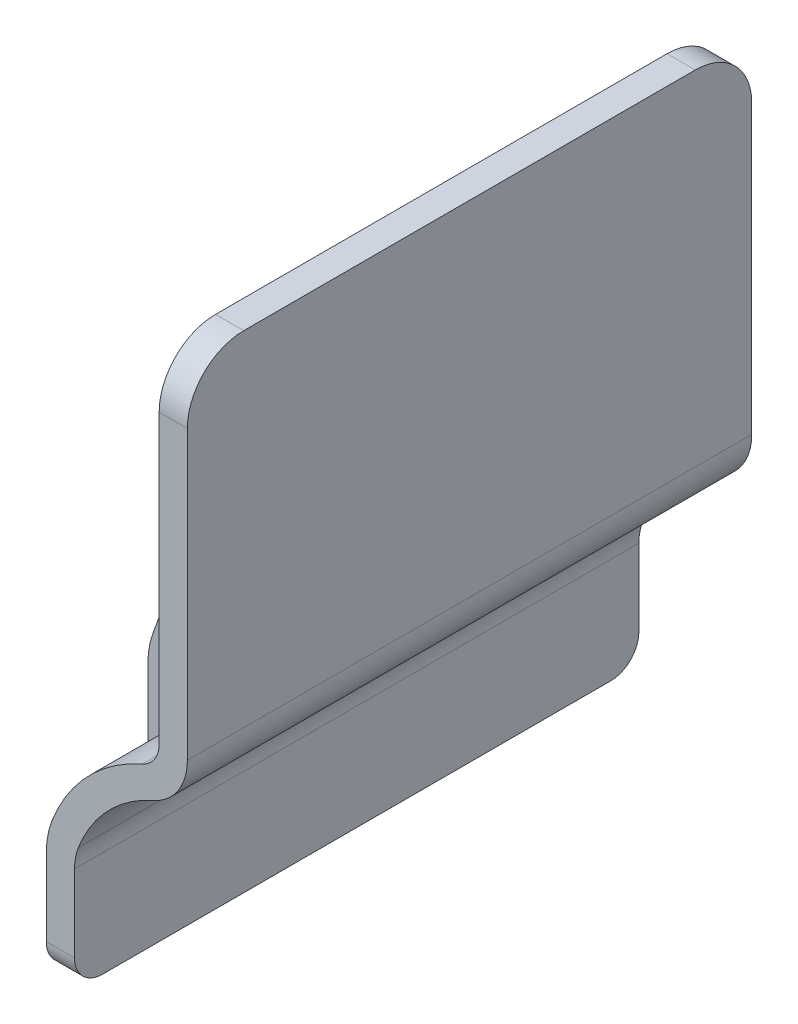
ISO-10303-21;
HEADER;
FILE_DESCRIPTION(('STEP AP214'),'2;1');
FILE_NAME('part.step','',(''),(''),'','','');
FILE_SCHEMA(('AUTOMOTIVE_DESIGN { 1 0 10303 214 1 1 1 1 }'));
ENDSEC;
DATA;
#1=APPLICATION_CONTEXT('core data for automotive mechanical design processes');
#2=APPLICATION_PROTOCOL_DEFINITION('international standard','automotive_design',2000,#1);
#3=PRODUCT_CONTEXT('',#1,'mechanical');
#4=PRODUCT('Part','Part','',(#3));
#5=PRODUCT_RELATED_PRODUCT_CATEGORY('part','',(#4));
#6=PRODUCT_DEFINITION_FORMATION('','',#4);
#7=PRODUCT_DEFINITION_CONTEXT('part definition',#1,'design');
#8=PRODUCT_DEFINITION('design','',#6,#7);
#9=PRODUCT_DEFINITION_SHAPE('','',#8);
#10=(LENGTH_UNIT() NAMED_UNIT(*) SI_UNIT(.MILLI.,.METRE.));
#11=(NAMED_UNIT(*) PLANE_ANGLE_UNIT() SI_UNIT($,.RADIAN.));
#12=(NAMED_UNIT(*) SI_UNIT($,.STERADIAN.) SOLID_ANGLE_UNIT());
#13=UNCERTAINTY_MEASURE_WITH_UNIT(LENGTH_MEASURE(1.E-05),#10,'distance_accuracy_value','');
#14=(GEOMETRIC_REPRESENTATION_CONTEXT(3) GLOBAL_UNCERTAINTY_ASSIGNED_CONTEXT((#13)) GLOBAL_UNIT_ASSIGNED_CONTEXT((#10,
#11,#12)) REPRESENTATION_CONTEXT('',''));
#15=CARTESIAN_POINT('',(0.,0.,0.));
#16=DIRECTION('',(0.,0.,1.));
#17=DIRECTION('',(1.,0.,0.));
#18=AXIS2_PLACEMENT_3D('',#15,#16,#17);
#19=CARTESIAN_POINT('',(6.,192.32802986469,-33.0000000000047));
#20=DIRECTION('',(0.,0.,-1.));
#21=DIRECTION('',(-1.,0.,0.));
#22=AXIS2_PLACEMENT_3D('',#19,#20,#21);
#23=CYLINDRICAL_SURFACE('',#22,5.);
#24=CARTESIAN_POINT('',(6.,192.32802986469,-111.000000000005));
#25=DIRECTION('',(0.,0.,-1.));
#26=DIRECTION('',(-1.,0.,0.));
#27=AXIS2_PLACEMENT_3D('',#24,#25,#26);
#28=CIRCLE('',#27,5.00000000000001);
#29=CARTESIAN_POINT('',(11.,192.32802986469,-111.000000000005));
#30=VERTEX_POINT('',#29);
#31=CARTESIAN_POINT('',(8.,187.745454169734,-111.000000000005));
#32=VERTEX_POINT('',#31);
#33=EDGE_CURVE('E286',#30,#32,#28,.T.);
#34=ORIENTED_EDGE('',*,*,#33,.T.);
#35=DIRECTION('',(0.,0.,-1.));
#36=VECTOR('',#35,1.);
#37=CARTESIAN_POINT('',(7.99999999999999,187.745454169734,-33.0000000000047));
#38=LINE('',#37,#36);
#39=CARTESIAN_POINT('',(8.,187.745454169734,-55.0000000000047));
#40=VERTEX_POINT('',#39);
#41=EDGE_CURVE('E420',#40,#32,#38,.T.);
#42=ORIENTED_EDGE('',*,*,#41,.F.);
#43=CARTESIAN_POINT('',(6.,192.32802986469,-55.0000000000047));
#44=DIRECTION('',(0.,0.,1.));
#45=DIRECTION('',(1.,0.,0.));
#46=AXIS2_PLACEMENT_3D('',#43,#44,#45);
#47=CIRCLE('',#46,5.);
#48=CARTESIAN_POINT('',(11.,192.32802986469,-55.0000000000047));
#49=VERTEX_POINT('',#48);
#50=EDGE_CURVE('E323',#40,#49,#47,.T.);
#51=ORIENTED_EDGE('',*,*,#50,.T.);
#52=DIRECTION('',(0.,0.,-1.));
#53=VECTOR('',#52,1.);
#54=CARTESIAN_POINT('',(11.,192.32802986469,-33.0000000000047));
#55=LINE('',#54,#53);
#56=EDGE_CURVE('E425',#49,#30,#55,.T.);
#57=ORIENTED_EDGE('',*,*,#56,.T.);
#58=EDGE_LOOP('',(#34,#42,#51,#57));
#59=FACE_BOUND('',#58,.T.);
#60=ADVANCED_FACE('F35',(#59),#23,.F.);
#61=CARTESIAN_POINT('',(20.,160.249999999999,-33.0000000000047));
#62=DIRECTION('',(0.,0.,-1.));
#63=DIRECTION('',(-1.,0.,0.));
#64=AXIS2_PLACEMENT_3D('',#61,#62,#63);
#65=CYLINDRICAL_SURFACE('',#64,30.);
#66=CARTESIAN_POINT('',(20.,160.249999999999,-111.000000000005));
#67=DIRECTION('',(0.,0.,1.));
#68=DIRECTION('',(-1.,0.,0.));
#69=AXIS2_PLACEMENT_3D('',#66,#67,#68);
#70=CIRCLE('',#69,30.);
#71=CARTESIAN_POINT('',(-8.,171.020329614268,-111.000000000005));
#72=VERTEX_POINT('',#71);
#73=EDGE_CURVE('E289',#32,#72,#70,.T.);
#74=ORIENTED_EDGE('',*,*,#73,.T.);
#75=DIRECTION('',(0.,0.,-1.));
#76=VECTOR('',#75,1.);
#77=CARTESIAN_POINT('',(-8.,171.020329614268,-33.0000000000047));
#78=LINE('',#77,#76);
#79=CARTESIAN_POINT('',(-7.99999999999999,171.020329614268,-55.0000000000047));
#80=VERTEX_POINT('',#79);
#81=EDGE_CURVE('E416',#80,#72,#78,.T.);
#82=ORIENTED_EDGE('',*,*,#81,.F.);
#83=CARTESIAN_POINT('',(20.,160.249999999999,-55.0000000000047));
#84=DIRECTION('',(0.,0.,-1.));
#85=DIRECTION('',(1.,0.,0.));
#86=AXIS2_PLACEMENT_3D('',#83,#84,#85);
#87=CIRCLE('',#86,30.);
#88=EDGE_CURVE('E320',#80,#40,#87,.T.);
#89=ORIENTED_EDGE('',*,*,#88,.T.);
#90=ORIENTED_EDGE('',*,*,#41,.T.);
#91=EDGE_LOOP('',(#74,#82,#89,#90));
#92=FACE_BOUND('',#91,.T.);
#93=ADVANCED_FACE('F580',(#92),#65,.T.);
#94=CARTESIAN_POINT('',(6.00000000000001,165.635164807134,-33.0000000000047));
#95=DIRECTION('',(0.,0.,-1.));
#96=DIRECTION('',(-1.,0.,0.));
#97=AXIS2_PLACEMENT_3D('',#94,#95,#96);
#98=CYLINDRICAL_SURFACE('',#97,15.);
#99=CARTESIAN_POINT('',(6.00000000000001,165.635164807134,-111.000000000005));
#100=DIRECTION('',(0.,0.,1.));
#101=DIRECTION('',(-1.,0.,0.));
#102=AXIS2_PLACEMENT_3D('',#99,#100,#101);
#103=CIRCLE('',#102,15.);
#104=CARTESIAN_POINT('',(-8.99999999999999,165.635164807134,-111.000000000005));
#105=VERTEX_POINT('',#104);
#106=EDGE_CURVE('E292',#72,#105,#103,.T.);
#107=ORIENTED_EDGE('',*,*,#106,.T.);
#108=DIRECTION('',(0.,0.,-1.));
#109=VECTOR('',#108,1.);
#110=CARTESIAN_POINT('',(-8.99999999999999,165.635164807134,-33.0000000000047));
#111=LINE('',#110,#109);
#112=CARTESIAN_POINT('',(-8.99999999999999,165.635164807134,-55.0000000000047));
#113=VERTEX_POINT('',#112);
#114=EDGE_CURVE('E411',#113,#105,#111,.T.);
#115=ORIENTED_EDGE('',*,*,#114,.F.);
#116=CARTESIAN_POINT('',(6.00000000000001,165.635164807134,-55.0000000000047));
#117=DIRECTION('',(0.,0.,-1.));
#118=DIRECTION('',(1.,0.,0.));
#119=AXIS2_PLACEMENT_3D('',#116,#117,#118);
#120=CIRCLE('',#119,15.);
#121=EDGE_CURVE('E317',#113,#80,#120,.T.);
#122=ORIENTED_EDGE('',*,*,#121,.T.);
#123=ORIENTED_EDGE('',*,*,#81,.T.);
#124=EDGE_LOOP('',(#107,#115,#122,#123));
#125=FACE_BOUND('',#124,.T.);
#126=ADVANCED_FACE('F588',(#125),#98,.T.);
#127=CARTESIAN_POINT('',(11.,253.250000000002,-33.0000000000047));
#128=DIRECTION('',(1.,0.,0.));
#129=DIRECTION('',(0.,0.,-1.));
#130=AXIS2_PLACEMENT_3D('',#127,#128,#129);
#131=PLANE('',#130);
#132=CARTESIAN_POINT('',(11.,192.32802986469,-115.000000000005));
#133=VERTEX_POINT('',#132);
#134=CARTESIAN_POINT('',(11.,192.32802986469,-133.000000000005));
#135=VERTEX_POINT('',#134);
#136=EDGE_CURVE('E269',#133,#135,#55,.T.);
#137=ORIENTED_EDGE('',*,*,#136,.F.);
#138=DIRECTION('',(0.,-1.,0.));
#139=VECTOR('',#138,1.);
#140=CARTESIAN_POINT('',(11.,245.894904710629,-115.000000000005));
#141=LINE('',#140,#139);
#142=CARTESIAN_POINT('',(11.,245.894904710629,-115.000000000005));
#143=VERTEX_POINT('',#142);
#144=EDGE_CURVE('E246',#143,#133,#141,.T.);
#145=ORIENTED_EDGE('',*,*,#144,.F.);
#146=DIRECTION('',(0.,0.,1.));
#147=VECTOR('',#146,1.);
#148=CARTESIAN_POINT('',(11.,245.894904710629,-115.000000000005));
#149=LINE('',#148,#147);
#150=CARTESIAN_POINT('',(11.,245.894904710629,-111.000000000005));
#151=VERTEX_POINT('',#150);
#152=EDGE_CURVE('E257',#143,#151,#149,.T.);
#153=ORIENTED_EDGE('',*,*,#152,.T.);
#154=DIRECTION('',(0.,-1.,0.));
#155=VECTOR('',#154,1.);
#156=CARTESIAN_POINT('',(11.,245.894904710629,-111.000000000005));
#157=LINE('',#156,#155);
#158=EDGE_CURVE('E284',#151,#30,#157,.T.);
#159=ORIENTED_EDGE('',*,*,#158,.T.);
#160=ORIENTED_EDGE('',*,*,#56,.F.);
#161=DIRECTION('',(0.,1.,0.));
#162=VECTOR('',#161,1.);
#163=CARTESIAN_POINT('',(11.,192.32802986469,-55.0000000000047));
#164=LINE('',#163,#162);
#165=CARTESIAN_POINT('',(11.,245.894904710629,-55.0000000000047));
#166=VERTEX_POINT('',#165);
#167=EDGE_CURVE('E326',#49,#166,#164,.T.);
#168=ORIENTED_EDGE('',*,*,#167,.T.);
#169=DIRECTION('',(0.,0.,1.));
#170=VECTOR('',#169,1.);
#171=CARTESIAN_POINT('',(11.,245.894904710629,-55.0000000000047));
#172=LINE('',#171,#170);
#173=CARTESIAN_POINT('',(11.,245.894904710629,-51.0000000000047));
#174=VERTEX_POINT('',#173);
#175=EDGE_CURVE('E348',#166,#174,#172,.T.);
#176=ORIENTED_EDGE('',*,*,#175,.T.);
#177=DIRECTION('',(0.,1.,0.));
#178=VECTOR('',#177,1.);
#179=CARTESIAN_POINT('',(11.,192.32802986469,-51.0000000000047));
#180=LINE('',#179,#178);
#181=CARTESIAN_POINT('',(11.,192.32802986469,-51.0000000000047));
#182=VERTEX_POINT('',#181);
#183=EDGE_CURVE('E310',#182,#174,#180,.T.);
#184=ORIENTED_EDGE('',*,*,#183,.F.);
#185=CARTESIAN_POINT('',(11.,192.32802986469,-33.0000000000047));
#186=VERTEX_POINT('',#185);
#187=EDGE_CURVE('E421',#186,#182,#55,.T.);
#188=ORIENTED_EDGE('',*,*,#187,.F.);
#189=DIRECTION('',(0.,-1.,0.));
#190=VECTOR('',#189,1.);
#191=CARTESIAN_POINT('',(11.,253.250000000002,-33.0000000000047));
#192=LINE('',#191,#190);
#193=CARTESIAN_POINT('',(11.,243.250000000002,-33.0000000000047));
#194=VERTEX_POINT('',#193);
#195=EDGE_CURVE('E369',#194,#186,#192,.T.);
#196=ORIENTED_EDGE('',*,*,#195,.F.);
#197=CARTESIAN_POINT('',(11.,243.250000000002,-43.0000000000047));
#198=DIRECTION('',(1.,0.,0.));
#199=DIRECTION('',(0.,0.,-1.));
#200=AXIS2_PLACEMENT_3D('',#197,#198,#199);
#201=CIRCLE('',#200,10.);
#202=CARTESIAN_POINT('',(11.,253.250000000002,-43.0000000000047));
#203=VERTEX_POINT('',#202);
#204=EDGE_CURVE('E451',#194,#203,#201,.F.);
#205=ORIENTED_EDGE('',*,*,#204,.T.);
#206=DIRECTION('',(0.,0.,-1.));
#207=VECTOR('',#206,1.);
#208=CARTESIAN_POINT('',(11.,253.250000000002,-33.0000000000047));
#209=LINE('',#208,#207);
#210=CARTESIAN_POINT('',(11.,253.250000000002,-123.000000000005));
#211=VERTEX_POINT('',#210);
#212=EDGE_CURVE('E424',#203,#211,#209,.T.);
#213=ORIENTED_EDGE('',*,*,#212,.T.);
#214=CARTESIAN_POINT('',(11.,243.250000000002,-123.000000000005));
#215=DIRECTION('',(1.,0.,0.));
#216=DIRECTION('',(0.,0.,-1.));
#217=AXIS2_PLACEMENT_3D('',#214,#215,#216);
#218=CIRCLE('',#217,10.);
#219=CARTESIAN_POINT('',(11.,243.250000000002,-133.000000000005));
#220=VERTEX_POINT('',#219);
#221=EDGE_CURVE('E449',#211,#220,#218,.F.);
#222=ORIENTED_EDGE('',*,*,#221,.T.);
#223=DIRECTION('',(0.,-1.,0.));
#224=VECTOR('',#223,1.);
#225=CARTESIAN_POINT('',(11.,253.250000000002,-133.000000000005));
#226=LINE('',#225,#224);
#227=EDGE_CURVE('E391',#220,#135,#226,.T.);
#228=ORIENTED_EDGE('',*,*,#227,.T.);
#229=EDGE_LOOP('',(#137,#145,#153,#159,#160,#168,#176,#184,#188,#196,#205,#213,#222,#228));
#230=FACE_BOUND('',#229,.T.);
#231=ADVANCED_FACE('F267',(#230),#131,.F.);
#232=CARTESIAN_POINT('',(8.,187.745454169734,-115.000000000005));
#233=VERTEX_POINT('',#232);
#234=CARTESIAN_POINT('',(7.99999999999999,187.745454169734,-133.000000000005));
#235=VERTEX_POINT('',#234);
#236=EDGE_CURVE('E415',#233,#235,#38,.T.);
#237=ORIENTED_EDGE('',*,*,#236,.F.);
#238=CARTESIAN_POINT('',(6.,192.32802986469,-115.000000000005));
#239=DIRECTION('',(0.,0.,-1.));
#240=DIRECTION('',(-1.,0.,0.));
#241=AXIS2_PLACEMENT_3D('',#238,#239,#240);
#242=CIRCLE('',#241,5.00000000000001);
#243=EDGE_CURVE('E270',#133,#233,#242,.T.);
#244=ORIENTED_EDGE('',*,*,#243,.F.);
#245=ORIENTED_EDGE('',*,*,#136,.T.);
#246=CARTESIAN_POINT('',(6.,192.32802986469,-133.000000000005));
#247=DIRECTION('',(0.,0.,-1.));
#248=DIRECTION('',(1.,0.,0.));
#249=AXIS2_PLACEMENT_3D('',#246,#247,#248);
#250=CIRCLE('',#249,5.);
#251=EDGE_CURVE('E393',#135,#235,#250,.T.);
#252=ORIENTED_EDGE('',*,*,#251,.T.);
#253=EDGE_LOOP('',(#237,#244,#245,#252));
#254=FACE_BOUND('',#253,.T.);
#255=ADVANCED_FACE('F567',(#254),#23,.F.);
#256=CARTESIAN_POINT('',(-8.,171.020329614268,-115.000000000005));
#257=VERTEX_POINT('',#256);
#258=CARTESIAN_POINT('',(-8.,171.020329614268,-133.000000000005));
#259=VERTEX_POINT('',#258);
#260=EDGE_CURVE('E410',#257,#259,#78,.T.);
#261=ORIENTED_EDGE('',*,*,#260,.F.);
#262=CARTESIAN_POINT('',(20.,160.249999999999,-115.000000000005));
#263=DIRECTION('',(0.,0.,1.));
#264=DIRECTION('',(-1.,0.,0.));
#265=AXIS2_PLACEMENT_3D('',#262,#263,#264);
#266=CIRCLE('',#265,30.);
#267=EDGE_CURVE('E272',#233,#257,#266,.T.);
#268=ORIENTED_EDGE('',*,*,#267,.F.);
#269=ORIENTED_EDGE('',*,*,#236,.T.);
#270=CARTESIAN_POINT('',(20.,160.249999999999,-133.000000000005));
#271=DIRECTION('',(0.,0.,1.));
#272=DIRECTION('',(1.,0.,0.));
#273=AXIS2_PLACEMENT_3D('',#270,#271,#272);
#274=CIRCLE('',#273,30.);
#275=EDGE_CURVE('E396',#235,#259,#274,.T.);
#276=ORIENTED_EDGE('',*,*,#275,.T.);
#277=EDGE_LOOP('',(#261,#268,#269,#276));
#278=FACE_BOUND('',#277,.T.);
#279=ADVANCED_FACE('F575',(#278),#65,.T.);
#280=CARTESIAN_POINT('',(-8.99999999999999,165.635164807134,-115.000000000005));
#281=VERTEX_POINT('',#280);
#282=CARTESIAN_POINT('',(-8.99999999999999,165.635164807134,-133.000000000005));
#283=VERTEX_POINT('',#282);
#284=EDGE_CURVE('E406',#281,#283,#111,.T.);
#285=ORIENTED_EDGE('',*,*,#284,.F.);
#286=CARTESIAN_POINT('',(6.00000000000001,165.635164807134,-115.000000000005));
#287=DIRECTION('',(0.,0.,1.));
#288=DIRECTION('',(-1.,0.,0.));
#289=AXIS2_PLACEMENT_3D('',#286,#287,#288);
#290=CIRCLE('',#289,15.);
#291=EDGE_CURVE('E276',#257,#281,#290,.T.);
#292=ORIENTED_EDGE('',*,*,#291,.F.);
#293=ORIENTED_EDGE('',*,*,#260,.T.);
#294=CARTESIAN_POINT('',(6.00000000000001,165.635164807134,-133.000000000005));
#295=DIRECTION('',(0.,0.,1.));
#296=DIRECTION('',(-1.,0.,0.));
#297=AXIS2_PLACEMENT_3D('',#294,#295,#296);
#298=CIRCLE('',#297,15.);
#299=EDGE_CURVE('E399',#259,#283,#298,.T.);
#300=ORIENTED_EDGE('',*,*,#299,.T.);
#301=EDGE_LOOP('',(#285,#292,#293,#300));
#302=FACE_BOUND('',#301,.T.);
#303=ADVANCED_FACE('F592',(#302),#98,.T.);
#304=CARTESIAN_POINT('',(-8.99999999999999,146.999999999998,-33.0000000000047));
#305=DIRECTION('',(0.,1.,0.));
#306=DIRECTION('',(0.,0.,1.));
#307=AXIS2_PLACEMENT_3D('',#304,#305,#306);
#308=PLANE('',#307);
#309=DIRECTION('',(0.,0.,-1.));
#310=VECTOR('',#309,1.);
#311=CARTESIAN_POINT('',(-4.,146.999999999998,-33.0000000000047));
#312=LINE('',#311,#310);
#313=CARTESIAN_POINT('',(-4.,146.999999999998,-38.0000000000047));
#314=VERTEX_POINT('',#313);
#315=CARTESIAN_POINT('',(-4.,146.999999999998,-128.000000000005));
#316=VERTEX_POINT('',#315);
#317=EDGE_CURVE('E443',#314,#316,#312,.T.);
#318=ORIENTED_EDGE('',*,*,#317,.F.);
#319=DIRECTION('',(1.,0.,0.));
#320=VECTOR('',#319,1.);
#321=CARTESIAN_POINT('',(-8.99999999999999,146.999999999998,-38.0000000000047));
#322=LINE('',#321,#320);
#323=CARTESIAN_POINT('',(-8.99999999999999,146.999999999998,-38.0000000000047));
#324=VERTEX_POINT('',#323);
#325=EDGE_CURVE('E474',#314,#324,#322,.F.);
#326=ORIENTED_EDGE('',*,*,#325,.T.);
#327=DIRECTION('',(0.,0.,-1.));
#328=VECTOR('',#327,1.);
#329=CARTESIAN_POINT('',(-8.99999999999999,146.999999999998,-33.0000000000047));
#330=LINE('',#329,#328);
#331=CARTESIAN_POINT('',(-8.99999999999999,146.999999999998,-128.000000000005));
#332=VERTEX_POINT('',#331);
#333=EDGE_CURVE('E380',#324,#332,#330,.T.);
#334=ORIENTED_EDGE('',*,*,#333,.T.);
#335=DIRECTION('',(1.,0.,0.));
#336=VECTOR('',#335,1.);
#337=CARTESIAN_POINT('',(-4.,146.999999999998,-128.000000000005));
#338=LINE('',#337,#336);
#339=EDGE_CURVE('E471',#332,#316,#338,.T.);
#340=ORIENTED_EDGE('',*,*,#339,.T.);
#341=EDGE_LOOP('',(#318,#326,#334,#340));
#342=FACE_BOUND('',#341,.T.);
#343=ADVANCED_FACE('F495',(#342),#308,.F.);
#344=CARTESIAN_POINT('',(-3.99999999999999,165.635164807134,-33.0000000000047));
#345=DIRECTION('',(-1.,0.,0.));
#346=DIRECTION('',(0.,-1.,0.));
#347=AXIS2_PLACEMENT_3D('',#344,#345,#346);
#348=PLANE('',#347);
#349=DIRECTION('',(0.,1.,0.));
#350=VECTOR('',#349,1.);
#351=CARTESIAN_POINT('',(-3.99999999999999,165.635164807134,-33.0000000000047));
#352=LINE('',#351,#350);
#353=CARTESIAN_POINT('',(-4.,151.999999999998,-33.0000000000047));
#354=VERTEX_POINT('',#353);
#355=CARTESIAN_POINT('',(-3.99999999999999,165.635164807134,-33.0000000000047));
#356=VERTEX_POINT('',#355);
#357=EDGE_CURVE('E357',#354,#356,#352,.T.);
#358=ORIENTED_EDGE('',*,*,#357,.F.);
#359=CARTESIAN_POINT('',(-4.,151.999999999998,-38.0000000000047));
#360=DIRECTION('',(-1.,0.,0.));
#361=DIRECTION('',(0.,-1.,0.));
#362=AXIS2_PLACEMENT_3D('',#359,#360,#361);
#363=CIRCLE('',#362,5.);
#364=EDGE_CURVE('E469',#354,#314,#363,.F.);
#365=ORIENTED_EDGE('',*,*,#364,.T.);
#366=ORIENTED_EDGE('',*,*,#317,.T.);
#367=CARTESIAN_POINT('',(-4.,151.999999999998,-128.000000000005));
#368=DIRECTION('',(-1.,0.,0.));
#369=DIRECTION('',(0.,-1.,0.));
#370=AXIS2_PLACEMENT_3D('',#367,#368,#369);
#371=CIRCLE('',#370,5.);
#372=CARTESIAN_POINT('',(-4.,151.999999999998,-133.000000000005));
#373=VERTEX_POINT('',#372);
#374=EDGE_CURVE('E467',#316,#373,#371,.F.);
#375=ORIENTED_EDGE('',*,*,#374,.T.);
#376=DIRECTION('',(0.,1.,0.));
#377=VECTOR('',#376,1.);
#378=CARTESIAN_POINT('',(-3.99999999999999,165.635164807134,-133.000000000005));
#379=LINE('',#378,#377);
#380=CARTESIAN_POINT('',(-3.99999999999999,165.635164807134,-133.000000000005));
#381=VERTEX_POINT('',#380);
#382=EDGE_CURVE('E351',#373,#381,#379,.T.);
#383=ORIENTED_EDGE('',*,*,#382,.T.);
#384=DIRECTION('',(0.,0.,-1.));
#385=VECTOR('',#384,1.);
#386=CARTESIAN_POINT('',(-3.99999999999999,165.635164807134,-33.0000000000047));
#387=LINE('',#386,#385);
#388=EDGE_CURVE('E440',#356,#381,#387,.T.);
#389=ORIENTED_EDGE('',*,*,#388,.F.);
#390=EDGE_LOOP('',(#358,#365,#366,#375,#383,#389));
#391=FACE_BOUND('',#390,.T.);
#392=ADVANCED_FACE('F492',(#391),#348,.F.);
#393=CARTESIAN_POINT('',(6.00000000000001,165.635164807134,-33.0000000000047));
#394=DIRECTION('',(0.,0.,-1.));
#395=DIRECTION('',(-1.,0.,0.));
#396=AXIS2_PLACEMENT_3D('',#393,#394,#395);
#397=CYLINDRICAL_SURFACE('',#396,10.);
#398=CARTESIAN_POINT('',(6.00000000000001,165.635164807134,-133.000000000005));
#399=DIRECTION('',(0.,0.,-1.));
#400=DIRECTION('',(-1.,0.,0.));
#401=AXIS2_PLACEMENT_3D('',#398,#399,#400);
#402=CIRCLE('',#401,10.);
#403=CARTESIAN_POINT('',(-3.33333333333333,169.225274678557,-133.000000000005));
#404=VERTEX_POINT('',#403);
#405=EDGE_CURVE('E382',#381,#404,#402,.T.);
#406=ORIENTED_EDGE('',*,*,#405,.T.);
#407=DIRECTION('',(0.,0.,-1.));
#408=VECTOR('',#407,1.);
#409=CARTESIAN_POINT('',(-3.33333333333333,169.225274678557,-33.0000000000047));
#410=LINE('',#409,#408);
#411=CARTESIAN_POINT('',(-3.33333333333333,169.225274678557,-33.0000000000047));
#412=VERTEX_POINT('',#411);
#413=EDGE_CURVE('E437',#412,#404,#410,.T.);
#414=ORIENTED_EDGE('',*,*,#413,.F.);
#415=CARTESIAN_POINT('',(6.00000000000001,165.635164807134,-33.0000000000047));
#416=DIRECTION('',(0.,0.,-1.));
#417=DIRECTION('',(-1.,0.,0.));
#418=AXIS2_PLACEMENT_3D('',#415,#416,#417);
#419=CIRCLE('',#418,10.);
#420=EDGE_CURVE('E359',#356,#412,#419,.T.);
#421=ORIENTED_EDGE('',*,*,#420,.F.);
#422=ORIENTED_EDGE('',*,*,#388,.T.);
#423=EDGE_LOOP('',(#406,#414,#421,#422));
#424=FACE_BOUND('',#423,.T.);
#425=ADVANCED_FACE('F509',(#424),#397,.F.);
#426=CARTESIAN_POINT('',(20.,160.249999999999,-33.0000000000047));
#427=DIRECTION('',(0.,0.,-1.));
#428=DIRECTION('',(-1.,0.,0.));
#429=AXIS2_PLACEMENT_3D('',#426,#427,#428);
#430=CYLINDRICAL_SURFACE('',#429,25.);
#431=CARTESIAN_POINT('',(20.,160.249999999999,-133.000000000005));
#432=DIRECTION('',(0.,0.,-1.));
#433=DIRECTION('',(1.,0.,0.));
#434=AXIS2_PLACEMENT_3D('',#431,#432,#433);
#435=CIRCLE('',#434,25.);
#436=CARTESIAN_POINT('',(10.,183.162878474778,-133.000000000005));
#437=VERTEX_POINT('',#436);
#438=EDGE_CURVE('E384',#404,#437,#435,.T.);
#439=ORIENTED_EDGE('',*,*,#438,.T.);
#440=DIRECTION('',(0.,0.,-1.));
#441=VECTOR('',#440,1.);
#442=CARTESIAN_POINT('',(10.,183.162878474778,-33.0000000000047));
#443=LINE('',#442,#441);
#444=CARTESIAN_POINT('',(10.,183.162878474778,-33.0000000000047));
#445=VERTEX_POINT('',#444);
#446=EDGE_CURVE('E434',#445,#437,#443,.T.);
#447=ORIENTED_EDGE('',*,*,#446,.F.);
#448=CARTESIAN_POINT('',(20.,160.249999999999,-33.0000000000047));
#449=DIRECTION('',(0.,0.,-1.));
#450=DIRECTION('',(1.,0.,0.));
#451=AXIS2_PLACEMENT_3D('',#448,#449,#450);
#452=CIRCLE('',#451,25.);
#453=EDGE_CURVE('E362',#412,#445,#452,.T.);
#454=ORIENTED_EDGE('',*,*,#453,.F.);
#455=ORIENTED_EDGE('',*,*,#413,.T.);
#456=EDGE_LOOP('',(#439,#447,#454,#455));
#457=FACE_BOUND('',#456,.T.);
#458=ADVANCED_FACE('F513',(#457),#430,.F.);
#459=CARTESIAN_POINT('',(6.,192.32802986469,-33.0000000000047));
#460=DIRECTION('',(0.,0.,-1.));
#461=DIRECTION('',(-1.,0.,0.));
#462=AXIS2_PLACEMENT_3D('',#459,#460,#461);
#463=CYLINDRICAL_SURFACE('',#462,10.);
#464=CARTESIAN_POINT('',(6.,192.32802986469,-133.000000000005));
#465=DIRECTION('',(0.,0.,1.));
#466=DIRECTION('',(1.,0.,0.));
#467=AXIS2_PLACEMENT_3D('',#464,#465,#466);
#468=CIRCLE('',#467,10.);
#469=CARTESIAN_POINT('',(16.,192.32802986469,-133.000000000005));
#470=VERTEX_POINT('',#469);
#471=EDGE_CURVE('E386',#437,#470,#468,.T.);
#472=ORIENTED_EDGE('',*,*,#471,.T.);
#473=DIRECTION('',(0.,0.,-1.));
#474=VECTOR('',#473,1.);
#475=CARTESIAN_POINT('',(16.,192.32802986469,-33.0000000000047));
#476=LINE('',#475,#474);
#477=CARTESIAN_POINT('',(16.,192.32802986469,-33.0000000000047));
#478=VERTEX_POINT('',#477);
#479=EDGE_CURVE('E431',#478,#470,#476,.T.);
#480=ORIENTED_EDGE('',*,*,#479,.F.);
#481=CARTESIAN_POINT('',(6.,192.32802986469,-33.0000000000047));
#482=DIRECTION('',(0.,0.,1.));
#483=DIRECTION('',(1.,0.,0.));
#484=AXIS2_PLACEMENT_3D('',#481,#482,#483);
#485=CIRCLE('',#484,10.);
#486=EDGE_CURVE('E364',#445,#478,#485,.T.);
#487=ORIENTED_EDGE('',*,*,#486,.F.);
#488=ORIENTED_EDGE('',*,*,#446,.T.);
#489=EDGE_LOOP('',(#472,#480,#487,#488));
#490=FACE_BOUND('',#489,.T.);
#491=ADVANCED_FACE('F520',(#490),#463,.T.);
#492=CARTESIAN_POINT('',(16.,253.250000000002,-33.0000000000047));
#493=DIRECTION('',(-1.,0.,0.));
#494=DIRECTION('',(0.,0.,1.));
#495=AXIS2_PLACEMENT_3D('',#492,#493,#494);
#496=PLANE('',#495);
#497=DIRECTION('',(0.,0.,-1.));
#498=VECTOR('',#497,1.);
#499=CARTESIAN_POINT('',(16.,253.250000000002,-33.0000000000047));
#500=LINE('',#499,#498);
#501=CARTESIAN_POINT('',(16.,253.250000000002,-43.0000000000047));
#502=VERTEX_POINT('',#501);
#503=CARTESIAN_POINT('',(16.,253.250000000002,-123.000000000005));
#504=VERTEX_POINT('',#503);
#505=EDGE_CURVE('E428',#502,#504,#500,.T.);
#506=ORIENTED_EDGE('',*,*,#505,.F.);
#507=CARTESIAN_POINT('',(16.,243.250000000002,-43.0000000000047));
#508=DIRECTION('',(-1.,0.,0.));
#509=DIRECTION('',(0.,0.,1.));
#510=AXIS2_PLACEMENT_3D('',#507,#508,#509);
#511=CIRCLE('',#510,10.);
#512=CARTESIAN_POINT('',(16.,243.250000000002,-33.0000000000047));
#513=VERTEX_POINT('',#512);
#514=EDGE_CURVE('E460',#502,#513,#511,.F.);
#515=ORIENTED_EDGE('',*,*,#514,.T.);
#516=DIRECTION('',(0.,1.,0.));
#517=VECTOR('',#516,1.);
#518=CARTESIAN_POINT('',(16.,253.250000000002,-33.0000000000047));
#519=LINE('',#518,#517);
#520=EDGE_CURVE('E366',#478,#513,#519,.T.);
#521=ORIENTED_EDGE('',*,*,#520,.F.);
#522=ORIENTED_EDGE('',*,*,#479,.T.);
#523=DIRECTION('',(0.,1.,0.));
#524=VECTOR('',#523,1.);
#525=CARTESIAN_POINT('',(16.,253.250000000002,-133.000000000005));
#526=LINE('',#525,#524);
#527=CARTESIAN_POINT('',(16.,243.250000000002,-133.000000000005));
#528=VERTEX_POINT('',#527);
#529=EDGE_CURVE('E388',#470,#528,#526,.T.);
#530=ORIENTED_EDGE('',*,*,#529,.T.);
#531=CARTESIAN_POINT('',(16.,243.250000000002,-123.000000000005));
#532=DIRECTION('',(-1.,0.,0.));
#533=DIRECTION('',(0.,0.,1.));
#534=AXIS2_PLACEMENT_3D('',#531,#532,#533);
#535=CIRCLE('',#534,10.);
#536=EDGE_CURVE('E458',#528,#504,#535,.F.);
#537=ORIENTED_EDGE('',*,*,#536,.T.);
#538=EDGE_LOOP('',(#506,#515,#521,#522,#530,#537));
#539=FACE_BOUND('',#538,.T.);
#540=ADVANCED_FACE('F524',(#539),#496,.F.);
#541=CARTESIAN_POINT('',(11.,253.250000000002,-33.0000000000047));
#542=DIRECTION('',(0.,-1.,0.));
#543=DIRECTION('',(0.,0.,-1.));
#544=AXIS2_PLACEMENT_3D('',#541,#542,#543);
#545=PLANE('',#544);
#546=ORIENTED_EDGE('',*,*,#212,.F.);
#547=DIRECTION('',(-1.,0.,0.));
#548=VECTOR('',#547,1.);
#549=CARTESIAN_POINT('',(11.,253.250000000002,-43.0000000000047));
#550=LINE('',#549,#548);
#551=EDGE_CURVE('E456',#203,#502,#550,.F.);
#552=ORIENTED_EDGE('',*,*,#551,.T.);
#553=ORIENTED_EDGE('',*,*,#505,.T.);
#554=DIRECTION('',(-1.,0.,0.));
#555=VECTOR('',#554,1.);
#556=CARTESIAN_POINT('',(11.,253.250000000002,-123.000000000005));
#557=LINE('',#556,#555);
#558=EDGE_CURVE('E453',#504,#211,#557,.T.);
#559=ORIENTED_EDGE('',*,*,#558,.T.);
#560=EDGE_LOOP('',(#546,#552,#553,#559));
#561=FACE_BOUND('',#560,.T.);
#562=ADVANCED_FACE('F618',(#561),#545,.F.);
#563=ORIENTED_EDGE('',*,*,#187,.T.);
#564=CARTESIAN_POINT('',(6.,192.32802986469,-51.0000000000047));
#565=DIRECTION('',(0.,0.,1.));
#566=DIRECTION('',(1.,0.,0.));
#567=AXIS2_PLACEMENT_3D('',#564,#565,#566);
#568=CIRCLE('',#567,5.);
#569=CARTESIAN_POINT('',(8.,187.745454169734,-51.0000000000047));
#570=VERTEX_POINT('',#569);
#571=EDGE_CURVE('E344',#570,#182,#568,.T.);
#572=ORIENTED_EDGE('',*,*,#571,.F.);
#573=CARTESIAN_POINT('',(7.99999999999999,187.745454169734,-33.0000000000047));
#574=VERTEX_POINT('',#573);
#575=EDGE_CURVE('E417',#574,#570,#38,.T.);
#576=ORIENTED_EDGE('',*,*,#575,.F.);
#577=CARTESIAN_POINT('',(6.,192.32802986469,-33.0000000000047));
#578=DIRECTION('',(0.,0.,-1.));
#579=DIRECTION('',(1.,0.,0.));
#580=AXIS2_PLACEMENT_3D('',#577,#578,#579);
#581=CIRCLE('',#580,5.);
#582=EDGE_CURVE('E371',#186,#574,#581,.T.);
#583=ORIENTED_EDGE('',*,*,#582,.F.);
#584=EDGE_LOOP('',(#563,#572,#576,#583));
#585=FACE_BOUND('',#584,.T.);
#586=ADVANCED_FACE('F537',(#585),#23,.F.);
#587=ORIENTED_EDGE('',*,*,#575,.T.);
#588=CARTESIAN_POINT('',(20.,160.249999999999,-51.0000000000047));
#589=DIRECTION('',(0.,0.,-1.));
#590=DIRECTION('',(1.,0.,0.));
#591=AXIS2_PLACEMENT_3D('',#588,#589,#590);
#592=CIRCLE('',#591,30.);
#593=CARTESIAN_POINT('',(-7.99999999999999,171.020329614268,-51.0000000000047));
#594=VERTEX_POINT('',#593);
#595=EDGE_CURVE('E342',#594,#570,#592,.T.);
#596=ORIENTED_EDGE('',*,*,#595,.F.);
#597=CARTESIAN_POINT('',(-8.,171.020329614268,-33.0000000000047));
#598=VERTEX_POINT('',#597);
#599=EDGE_CURVE('E412',#598,#594,#78,.T.);
#600=ORIENTED_EDGE('',*,*,#599,.F.);
#601=CARTESIAN_POINT('',(20.,160.249999999999,-33.0000000000047));
#602=DIRECTION('',(0.,0.,1.));
#603=DIRECTION('',(1.,0.,0.));
#604=AXIS2_PLACEMENT_3D('',#601,#602,#603);
#605=CIRCLE('',#604,30.);
#606=EDGE_CURVE('E373',#574,#598,#605,.T.);
#607=ORIENTED_EDGE('',*,*,#606,.F.);
#608=EDGE_LOOP('',(#587,#596,#600,#607));
#609=FACE_BOUND('',#608,.T.);
#610=ADVANCED_FACE('F542',(#609),#65,.T.);
#611=ORIENTED_EDGE('',*,*,#599,.T.);
#612=CARTESIAN_POINT('',(6.00000000000001,165.635164807134,-51.0000000000047));
#613=DIRECTION('',(0.,0.,-1.));
#614=DIRECTION('',(1.,0.,0.));
#615=AXIS2_PLACEMENT_3D('',#612,#613,#614);
#616=CIRCLE('',#615,15.);
#617=CARTESIAN_POINT('',(-8.99999999999999,165.635164807134,-51.0000000000047));
#618=VERTEX_POINT('',#617);
#619=EDGE_CURVE('E340',#618,#594,#616,.T.);
#620=ORIENTED_EDGE('',*,*,#619,.F.);
#621=CARTESIAN_POINT('',(-8.99999999999999,165.635164807134,-33.0000000000047));
#622=VERTEX_POINT('',#621);
#623=EDGE_CURVE('E407',#622,#618,#111,.T.);
#624=ORIENTED_EDGE('',*,*,#623,.F.);
#625=CARTESIAN_POINT('',(6.00000000000001,165.635164807134,-33.0000000000047));
#626=DIRECTION('',(0.,0.,1.));
#627=DIRECTION('',(-1.,0.,0.));
#628=AXIS2_PLACEMENT_3D('',#625,#626,#627);
#629=CIRCLE('',#628,15.);
#630=EDGE_CURVE('E375',#598,#622,#629,.T.);
#631=ORIENTED_EDGE('',*,*,#630,.F.);
#632=EDGE_LOOP('',(#611,#620,#624,#631));
#633=FACE_BOUND('',#632,.T.);
#634=ADVANCED_FACE('F545',(#633),#98,.T.);
#635=CARTESIAN_POINT('',(-8.99999999999999,165.635164807134,-33.0000000000047));
#636=DIRECTION('',(1.,0.,0.));
#637=DIRECTION('',(0.,0.,-1.));
#638=AXIS2_PLACEMENT_3D('',#635,#636,#637);
#639=PLANE('',#638);
#640=ORIENTED_EDGE('',*,*,#333,.F.);
#641=CARTESIAN_POINT('',(-8.99999999999999,151.999999999998,-38.0000000000047));
#642=DIRECTION('',(1.,0.,0.));
#643=DIRECTION('',(0.,0.,-1.));
#644=AXIS2_PLACEMENT_3D('',#641,#642,#643);
#645=CIRCLE('',#644,5.);
#646=CARTESIAN_POINT('',(-8.99999999999999,151.999999999998,-33.0000000000047));
#647=VERTEX_POINT('',#646);
#648=EDGE_CURVE('E43',#324,#647,#645,.F.);
#649=ORIENTED_EDGE('',*,*,#648,.T.);
#650=DIRECTION('',(0.,-1.,0.));
#651=VECTOR('',#650,1.);
#652=CARTESIAN_POINT('',(-8.99999999999999,165.635164807134,-33.0000000000047));
#653=LINE('',#652,#651);
#654=EDGE_CURVE('E377',#622,#647,#653,.T.);
#655=ORIENTED_EDGE('',*,*,#654,.F.);
#656=ORIENTED_EDGE('',*,*,#623,.T.);
#657=DIRECTION('',(0.,-1.,0.));
#658=VECTOR('',#657,1.);
#659=CARTESIAN_POINT('',(-8.99999999999999,185.655546900283,-51.0000000000047));
#660=LINE('',#659,#658);
#661=CARTESIAN_POINT('',(-8.99999999999999,185.655546900283,-51.0000000000047));
#662=VERTEX_POINT('',#661);
#663=EDGE_CURVE('E338',#662,#618,#660,.T.);
#664=ORIENTED_EDGE('',*,*,#663,.F.);
#665=DIRECTION('',(0.,0.,1.));
#666=VECTOR('',#665,1.);
#667=CARTESIAN_POINT('',(-8.99999999999999,185.655546900283,-55.0000000000047));
#668=LINE('',#667,#666);
#669=CARTESIAN_POINT('',(-8.99999999999999,185.655546900283,-55.0000000000047));
#670=VERTEX_POINT('',#669);
#671=EDGE_CURVE('E352',#670,#662,#668,.T.);
#672=ORIENTED_EDGE('',*,*,#671,.F.);
#673=DIRECTION('',(0.,-1.,0.));
#674=VECTOR('',#673,1.);
#675=CARTESIAN_POINT('',(-8.99999999999999,185.655546900283,-55.0000000000047));
#676=LINE('',#675,#674);
#677=EDGE_CURVE('E57',#670,#113,#676,.T.);
#678=ORIENTED_EDGE('',*,*,#677,.T.);
#679=ORIENTED_EDGE('',*,*,#114,.T.);
#680=DIRECTION('',(0.,1.,0.));
#681=VECTOR('',#680,1.);
#682=CARTESIAN_POINT('',(-8.99999999999999,165.635164807134,-111.000000000005));
#683=LINE('',#682,#681);
#684=CARTESIAN_POINT('',(-9.,185.655546900283,-111.000000000005));
#685=VERTEX_POINT('',#684);
#686=EDGE_CURVE('E295',#105,#685,#683,.T.);
#687=ORIENTED_EDGE('',*,*,#686,.T.);
#688=DIRECTION('',(0.,0.,1.));
#689=VECTOR('',#688,1.);
#690=CARTESIAN_POINT('',(-9.,185.655546900283,-115.000000000005));
#691=LINE('',#690,#689);
#692=CARTESIAN_POINT('',(-9.,185.655546900283,-115.000000000005));
#693=VERTEX_POINT('',#692);
#694=EDGE_CURVE('E264',#693,#685,#691,.T.);
#695=ORIENTED_EDGE('',*,*,#694,.F.);
#696=DIRECTION('',(0.,1.,0.));
#697=VECTOR('',#696,1.);
#698=CARTESIAN_POINT('',(-8.99999999999999,165.635164807134,-115.000000000005));
#699=LINE('',#698,#697);
#700=EDGE_CURVE('E50',#281,#693,#699,.T.);
#701=ORIENTED_EDGE('',*,*,#700,.F.);
#702=ORIENTED_EDGE('',*,*,#284,.T.);
#703=DIRECTION('',(0.,-1.,0.));
#704=VECTOR('',#703,1.);
#705=CARTESIAN_POINT('',(-8.99999999999999,165.635164807134,-133.000000000005));
#706=LINE('',#705,#704);
#707=CARTESIAN_POINT('',(-8.99999999999999,151.999999999998,-133.000000000005));
#708=VERTEX_POINT('',#707);
#709=EDGE_CURVE('E360',#283,#708,#706,.T.);
#710=ORIENTED_EDGE('',*,*,#709,.T.);
#711=CARTESIAN_POINT('',(-8.99999999999999,151.999999999998,-128.000000000005));
#712=DIRECTION('',(1.,0.,0.));
#713=DIRECTION('',(0.,0.,-1.));
#714=AXIS2_PLACEMENT_3D('',#711,#712,#713);
#715=CIRCLE('',#714,5.);
#716=EDGE_CURVE('E476',#708,#332,#715,.F.);
#717=ORIENTED_EDGE('',*,*,#716,.T.);
#718=EDGE_LOOP('',(#640,#649,#655,#656,#664,#672,#678,#679,#687,#695,#701,#702,#710,#717));
#719=FACE_BOUND('',#718,.T.);
#720=ADVANCED_FACE('F480',(#719),#639,.F.);
#721=CARTESIAN_POINT('',(6.00000000000001,165.635164807134,-33.0000000000047));
#722=DIRECTION('',(0.,0.,-1.));
#723=DIRECTION('',(-1.,0.,0.));
#724=AXIS2_PLACEMENT_3D('',#721,#722,#723);
#725=PLANE('',#724);
#726=ORIENTED_EDGE('',*,*,#654,.T.);
#727=DIRECTION('',(1.,0.,0.));
#728=VECTOR('',#727,1.);
#729=CARTESIAN_POINT('',(6.00000000000001,151.999999999998,-33.0000000000047));
#730=LINE('',#729,#728);
#731=EDGE_CURVE('E464',#647,#354,#730,.T.);
#732=ORIENTED_EDGE('',*,*,#731,.T.);
#733=ORIENTED_EDGE('',*,*,#357,.T.);
#734=ORIENTED_EDGE('',*,*,#420,.T.);
#735=ORIENTED_EDGE('',*,*,#453,.T.);
#736=ORIENTED_EDGE('',*,*,#486,.T.);
#737=ORIENTED_EDGE('',*,*,#520,.T.);
#738=DIRECTION('',(-1.,0.,0.));
#739=VECTOR('',#738,1.);
#740=CARTESIAN_POINT('',(6.00000000000001,243.250000000002,-33.0000000000047));
#741=LINE('',#740,#739);
#742=EDGE_CURVE('E446',#513,#194,#741,.T.);
#743=ORIENTED_EDGE('',*,*,#742,.T.);
#744=ORIENTED_EDGE('',*,*,#195,.T.);
#745=ORIENTED_EDGE('',*,*,#582,.T.);
#746=ORIENTED_EDGE('',*,*,#606,.T.);
#747=ORIENTED_EDGE('',*,*,#630,.T.);
#748=EDGE_LOOP('',(#726,#732,#733,#734,#735,#736,#737,#743,#744,#745,#746,#747));
#749=FACE_BOUND('',#748,.T.);
#750=ADVANCED_FACE('F485',(#749),#725,.F.);
#751=CARTESIAN_POINT('',(6.00000000000001,165.635164807134,-133.000000000005));
#752=DIRECTION('',(0.,0.,-1.));
#753=DIRECTION('',(-1.,0.,0.));
#754=AXIS2_PLACEMENT_3D('',#751,#752,#753);
#755=PLANE('',#754);
#756=ORIENTED_EDGE('',*,*,#382,.F.);
#757=DIRECTION('',(1.,0.,0.));
#758=VECTOR('',#757,1.);
#759=CARTESIAN_POINT('',(-8.99999999999999,151.999999999998,-133.000000000005));
#760=LINE('',#759,#758);
#761=EDGE_CURVE('E11',#373,#708,#760,.F.);
#762=ORIENTED_EDGE('',*,*,#761,.T.);
#763=ORIENTED_EDGE('',*,*,#709,.F.);
#764=ORIENTED_EDGE('',*,*,#299,.F.);
#765=ORIENTED_EDGE('',*,*,#275,.F.);
#766=ORIENTED_EDGE('',*,*,#251,.F.);
#767=ORIENTED_EDGE('',*,*,#227,.F.);
#768=DIRECTION('',(-1.,0.,0.));
#769=VECTOR('',#768,1.);
#770=CARTESIAN_POINT('',(16.,243.250000000002,-133.000000000005));
#771=LINE('',#770,#769);
#772=EDGE_CURVE('E462',#220,#528,#771,.F.);
#773=ORIENTED_EDGE('',*,*,#772,.T.);
#774=ORIENTED_EDGE('',*,*,#529,.F.);
#775=ORIENTED_EDGE('',*,*,#471,.F.);
#776=ORIENTED_EDGE('',*,*,#438,.F.);
#777=ORIENTED_EDGE('',*,*,#405,.F.);
#778=EDGE_LOOP('',(#756,#762,#763,#764,#765,#766,#767,#773,#774,#775,#776,#777));
#779=FACE_BOUND('',#778,.T.);
#780=ADVANCED_FACE('F503',(#779),#755,.T.);
#781=CARTESIAN_POINT('',(6.00000000000001,243.250000000002,-43.0000000000047));
#782=DIRECTION('',(-1.,0.,0.));
#783=DIRECTION('',(0.,0.,1.));
#784=AXIS2_PLACEMENT_3D('',#781,#782,#783);
#785=CYLINDRICAL_SURFACE('',#784,10.);
#786=ORIENTED_EDGE('',*,*,#514,.F.);
#787=ORIENTED_EDGE('',*,*,#551,.F.);
#788=ORIENTED_EDGE('',*,*,#204,.F.);
#789=ORIENTED_EDGE('',*,*,#742,.F.);
#790=EDGE_LOOP('',(#786,#787,#788,#789));
#791=FACE_BOUND('',#790,.T.);
#792=ADVANCED_FACE('F528',(#791),#785,.T.);
#793=CARTESIAN_POINT('',(11.,243.250000000002,-123.000000000005));
#794=DIRECTION('',(1.,0.,0.));
#795=DIRECTION('',(0.,0.,-1.));
#796=AXIS2_PLACEMENT_3D('',#793,#794,#795);
#797=CYLINDRICAL_SURFACE('',#796,10.);
#798=ORIENTED_EDGE('',*,*,#536,.F.);
#799=ORIENTED_EDGE('',*,*,#772,.F.);
#800=ORIENTED_EDGE('',*,*,#221,.F.);
#801=ORIENTED_EDGE('',*,*,#558,.F.);
#802=EDGE_LOOP('',(#798,#799,#800,#801));
#803=FACE_BOUND('',#802,.T.);
#804=ADVANCED_FACE('F642',(#803),#797,.T.);
#805=CARTESIAN_POINT('',(6.00000000000001,151.999999999998,-38.0000000000047));
#806=DIRECTION('',(1.,0.,0.));
#807=DIRECTION('',(0.,0.,-1.));
#808=AXIS2_PLACEMENT_3D('',#805,#806,#807);
#809=CYLINDRICAL_SURFACE('',#808,5.);
#810=ORIENTED_EDGE('',*,*,#648,.F.);
#811=ORIENTED_EDGE('',*,*,#325,.F.);
#812=ORIENTED_EDGE('',*,*,#364,.F.);
#813=ORIENTED_EDGE('',*,*,#731,.F.);
#814=EDGE_LOOP('',(#810,#811,#812,#813));
#815=FACE_BOUND('',#814,.T.);
#816=ADVANCED_FACE('F489',(#815),#809,.T.);
#817=CARTESIAN_POINT('',(-8.99999999999999,151.999999999998,-128.000000000005));
#818=DIRECTION('',(-1.,0.,0.));
#819=DIRECTION('',(0.,0.,1.));
#820=AXIS2_PLACEMENT_3D('',#817,#818,#819);
#821=CYLINDRICAL_SURFACE('',#820,5.);
#822=ORIENTED_EDGE('',*,*,#716,.F.);
#823=ORIENTED_EDGE('',*,*,#761,.F.);
#824=ORIENTED_EDGE('',*,*,#374,.F.);
#825=ORIENTED_EDGE('',*,*,#339,.F.);
#826=EDGE_LOOP('',(#822,#823,#824,#825));
#827=FACE_BOUND('',#826,.T.);
#828=ADVANCED_FACE('F37',(#827),#821,.T.);
#829=CARTESIAN_POINT('',(-4.,245.894904710629,-55.0000000000047));
#830=DIRECTION('',(0.,0.,1.));
#831=DIRECTION('',(1.,0.,0.));
#832=AXIS2_PLACEMENT_3D('',#829,#830,#831);
#833=CYLINDRICAL_SURFACE('',#832,15.);
#834=CARTESIAN_POINT('',(-4.,245.894904710629,-51.0000000000047));
#835=DIRECTION('',(0.,0.,-1.));
#836=DIRECTION('',(1.,0.,0.));
#837=AXIS2_PLACEMENT_3D('',#834,#835,#836);
#838=CIRCLE('',#837,15.);
#839=CARTESIAN_POINT('',(10.0953893117886,240.764602560744,-51.0000000000047));
#840=VERTEX_POINT('',#839);
#841=EDGE_CURVE('E263',#174,#840,#838,.T.);
#842=ORIENTED_EDGE('',*,*,#841,.F.);
#843=ORIENTED_EDGE('',*,*,#175,.F.);
#844=CARTESIAN_POINT('',(-4.,245.894904710629,-55.0000000000047));
#845=DIRECTION('',(0.,0.,-1.));
#846=DIRECTION('',(1.,0.,0.));
#847=AXIS2_PLACEMENT_3D('',#844,#845,#846);
#848=CIRCLE('',#847,15.);
#849=CARTESIAN_POINT('',(10.0953893117886,240.764602560744,-55.0000000000047));
#850=VERTEX_POINT('',#849);
#851=EDGE_CURVE('E306',#166,#850,#848,.T.);
#852=ORIENTED_EDGE('',*,*,#851,.T.);
#853=DIRECTION('',(0.,0.,1.));
#854=VECTOR('',#853,1.);
#855=CARTESIAN_POINT('',(10.0953893117886,240.764602560744,-55.0000000000047));
#856=LINE('',#855,#854);
#857=EDGE_CURVE('E329',#850,#840,#856,.T.);
#858=ORIENTED_EDGE('',*,*,#857,.T.);
#859=EDGE_LOOP('',(#842,#843,#852,#858));
#860=FACE_BOUND('',#859,.T.);
#861=ADVANCED_FACE('F561',(#860),#833,.F.);
#862=CARTESIAN_POINT('',(6.00000000000001,185.655546900283,-55.0000000000047));
#863=DIRECTION('',(0.,0.,1.));
#864=DIRECTION('',(1.,0.,0.));
#865=AXIS2_PLACEMENT_3D('',#862,#863,#864);
#866=CYLINDRICAL_SURFACE('',#865,15.);
#867=CARTESIAN_POINT('',(6.00000000000001,185.655546900283,-51.0000000000047));
#868=DIRECTION('',(0.,0.,1.));
#869=DIRECTION('',(1.,0.,0.));
#870=AXIS2_PLACEMENT_3D('',#867,#868,#869);
#871=CIRCLE('',#870,15.);
#872=CARTESIAN_POINT('',(-8.09538931178862,190.785849050168,-51.0000000000047));
#873=VERTEX_POINT('',#872);
#874=EDGE_CURVE('E335',#873,#662,#871,.T.);
#875=ORIENTED_EDGE('',*,*,#874,.F.);
#876=DIRECTION('',(0.,0.,1.));
#877=VECTOR('',#876,1.);
#878=CARTESIAN_POINT('',(-8.09538931178862,190.785849050168,-55.0000000000047));
#879=LINE('',#878,#877);
#880=CARTESIAN_POINT('',(-8.09538931178862,190.785849050168,-55.0000000000047));
#881=VERTEX_POINT('',#880);
#882=EDGE_CURVE('E354',#881,#873,#879,.T.);
#883=ORIENTED_EDGE('',*,*,#882,.F.);
#884=CARTESIAN_POINT('',(6.00000000000001,185.655546900283,-55.0000000000047));
#885=DIRECTION('',(0.,0.,1.));
#886=DIRECTION('',(1.,0.,0.));
#887=AXIS2_PLACEMENT_3D('',#884,#885,#886);
#888=CIRCLE('',#887,15.);
#889=EDGE_CURVE('E313',#881,#670,#888,.T.);
#890=ORIENTED_EDGE('',*,*,#889,.T.);
#891=ORIENTED_EDGE('',*,*,#671,.T.);
#892=EDGE_LOOP('',(#875,#883,#890,#891));
#893=FACE_BOUND('',#892,.T.);
#894=ADVANCED_FACE('F552',(#893),#866,.T.);
#895=CARTESIAN_POINT('',(10.0953893117886,240.764602560744,-55.0000000000047));
#896=DIRECTION('',(-0.939692620785908,0.34202014332567,0.));
#897=DIRECTION('',(-0.34202014332567,-0.939692620785908,0.));
#898=AXIS2_PLACEMENT_3D('',#895,#896,#897);
#899=PLANE('',#898);
#900=DIRECTION('',(-0.34202014332567,-0.939692620785908,0.));
#901=VECTOR('',#900,1.);
#902=CARTESIAN_POINT('',(10.0953893117886,240.764602560744,-51.0000000000047));
#903=LINE('',#902,#901);
#904=EDGE_CURVE('E332',#840,#873,#903,.T.);
#905=ORIENTED_EDGE('',*,*,#904,.F.);
#906=ORIENTED_EDGE('',*,*,#857,.F.);
#907=DIRECTION('',(-0.34202014332567,-0.939692620785908,0.));
#908=VECTOR('',#907,1.);
#909=CARTESIAN_POINT('',(10.0953893117886,240.764602560744,-55.0000000000047));
#910=LINE('',#909,#908);
#911=EDGE_CURVE('E309',#850,#881,#910,.T.);
#912=ORIENTED_EDGE('',*,*,#911,.T.);
#913=ORIENTED_EDGE('',*,*,#882,.T.);
#914=EDGE_LOOP('',(#905,#906,#912,#913));
#915=FACE_BOUND('',#914,.T.);
#916=ADVANCED_FACE('F559',(#915),#899,.T.);
#917=CARTESIAN_POINT('',(-4.,245.894904710629,-55.0000000000047));
#918=DIRECTION('',(0.,0.,1.));
#919=DIRECTION('',(1.,0.,0.));
#920=AXIS2_PLACEMENT_3D('',#917,#918,#919);
#921=PLANE('',#920);
#922=ORIENTED_EDGE('',*,*,#851,.F.);
#923=ORIENTED_EDGE('',*,*,#167,.F.);
#924=ORIENTED_EDGE('',*,*,#50,.F.);
#925=ORIENTED_EDGE('',*,*,#88,.F.);
#926=ORIENTED_EDGE('',*,*,#121,.F.);
#927=ORIENTED_EDGE('',*,*,#677,.F.);
#928=ORIENTED_EDGE('',*,*,#889,.F.);
#929=ORIENTED_EDGE('',*,*,#911,.F.);
#930=EDGE_LOOP('',(#922,#923,#924,#925,#926,#927,#928,#929));
#931=FACE_BOUND('',#930,.T.);
#932=ADVANCED_FACE('F557',(#931),#921,.F.);
#933=CARTESIAN_POINT('',(-4.,245.894904710629,-51.0000000000047));
#934=DIRECTION('',(0.,0.,1.));
#935=DIRECTION('',(1.,0.,0.));
#936=AXIS2_PLACEMENT_3D('',#933,#934,#935);
#937=PLANE('',#936);
#938=ORIENTED_EDGE('',*,*,#841,.T.);
#939=ORIENTED_EDGE('',*,*,#904,.T.);
#940=ORIENTED_EDGE('',*,*,#874,.T.);
#941=ORIENTED_EDGE('',*,*,#663,.T.);
#942=ORIENTED_EDGE('',*,*,#619,.T.);
#943=ORIENTED_EDGE('',*,*,#595,.T.);
#944=ORIENTED_EDGE('',*,*,#571,.T.);
#945=ORIENTED_EDGE('',*,*,#183,.T.);
#946=EDGE_LOOP('',(#938,#939,#940,#941,#942,#943,#944,#945));
#947=FACE_BOUND('',#946,.T.);
#948=ADVANCED_FACE('F549',(#947),#937,.T.);
#949=CARTESIAN_POINT('',(-4.,245.894904710629,-115.000000000005));
#950=DIRECTION('',(0.,0.,1.));
#951=DIRECTION('',(1.,0.,0.));
#952=AXIS2_PLACEMENT_3D('',#949,#950,#951);
#953=CYLINDRICAL_SURFACE('',#952,15.);
#954=CARTESIAN_POINT('',(-4.,245.894904710629,-111.000000000005));
#955=DIRECTION('',(0.,0.,1.));
#956=DIRECTION('',(-1.,0.,0.));
#957=AXIS2_PLACEMENT_3D('',#954,#955,#956);
#958=CIRCLE('',#957,15.);
#959=CARTESIAN_POINT('',(10.0953893117886,240.764602560744,-111.000000000005));
#960=VERTEX_POINT('',#959);
#961=EDGE_CURVE('E260',#960,#151,#958,.T.);
#962=ORIENTED_EDGE('',*,*,#961,.T.);
#963=ORIENTED_EDGE('',*,*,#152,.F.);
#964=CARTESIAN_POINT('',(-4.,245.894904710629,-115.000000000005));
#965=DIRECTION('',(0.,0.,1.));
#966=DIRECTION('',(-1.,0.,0.));
#967=AXIS2_PLACEMENT_3D('',#964,#965,#966);
#968=CIRCLE('',#967,15.);
#969=CARTESIAN_POINT('',(10.0953893117886,240.764602560744,-115.000000000005));
#970=VERTEX_POINT('',#969);
#971=EDGE_CURVE('E242',#970,#143,#968,.T.);
#972=ORIENTED_EDGE('',*,*,#971,.F.);
#973=DIRECTION('',(0.,0.,1.));
#974=VECTOR('',#973,1.);
#975=CARTESIAN_POINT('',(10.0953893117886,240.764602560744,-115.000000000005));
#976=LINE('',#975,#974);
#977=EDGE_CURVE('E282',#970,#960,#976,.T.);
#978=ORIENTED_EDGE('',*,*,#977,.T.);
#979=EDGE_LOOP('',(#962,#963,#972,#978));
#980=FACE_BOUND('',#979,.T.);
#981=ADVANCED_FACE('F258',(#980),#953,.F.);
#982=CARTESIAN_POINT('',(6.00000000000001,185.655546900283,-115.000000000005));
#983=DIRECTION('',(0.,0.,1.));
#984=DIRECTION('',(1.,0.,0.));
#985=AXIS2_PLACEMENT_3D('',#982,#983,#984);
#986=CYLINDRICAL_SURFACE('',#985,15.);
#987=CARTESIAN_POINT('',(6.00000000000001,185.655546900283,-111.000000000005));
#988=DIRECTION('',(0.,0.,-1.));
#989=DIRECTION('',(-1.,0.,0.));
#990=AXIS2_PLACEMENT_3D('',#987,#988,#989);
#991=CIRCLE('',#990,15.);
#992=CARTESIAN_POINT('',(-8.09538931178862,190.785849050168,-111.000000000005));
#993=VERTEX_POINT('',#992);
#994=EDGE_CURVE('E297',#685,#993,#991,.T.);
#995=ORIENTED_EDGE('',*,*,#994,.T.);
#996=DIRECTION('',(0.,0.,1.));
#997=VECTOR('',#996,1.);
#998=CARTESIAN_POINT('',(-8.09538931178862,190.785849050168,-115.000000000005));
#999=LINE('',#998,#997);
#1000=CARTESIAN_POINT('',(-8.09538931178862,190.785849050168,-115.000000000005));
#1001=VERTEX_POINT('',#1000);
#1002=EDGE_CURVE('E301',#1001,#993,#999,.T.);
#1003=ORIENTED_EDGE('',*,*,#1002,.F.);
#1004=CARTESIAN_POINT('',(6.00000000000001,185.655546900283,-115.000000000005));
#1005=DIRECTION('',(0.,0.,-1.));
#1006=DIRECTION('',(-1.,0.,0.));
#1007=AXIS2_PLACEMENT_3D('',#1004,#1005,#1006);
#1008=CIRCLE('',#1007,15.);
#1009=EDGE_CURVE('E279',#693,#1001,#1008,.T.);
#1010=ORIENTED_EDGE('',*,*,#1009,.F.);
#1011=ORIENTED_EDGE('',*,*,#694,.T.);
#1012=EDGE_LOOP('',(#995,#1003,#1010,#1011));
#1013=FACE_BOUND('',#1012,.T.);
#1014=ADVANCED_FACE('F596',(#1013),#986,.T.);
#1015=CARTESIAN_POINT('',(-8.09538931178862,190.785849050168,-115.000000000005));
#1016=DIRECTION('',(0.939692620785908,-0.34202014332567,0.));
#1017=DIRECTION('',(0.34202014332567,0.939692620785908,0.));
#1018=AXIS2_PLACEMENT_3D('',#1015,#1016,#1017);
#1019=PLANE('',#1018);
#1020=DIRECTION('',(0.34202014332567,0.939692620785908,0.));
#1021=VECTOR('',#1020,1.);
#1022=CARTESIAN_POINT('',(-8.09538931178862,190.785849050168,-111.000000000005));
#1023=LINE('',#1022,#1021);
#1024=EDGE_CURVE('E253',#993,#960,#1023,.T.);
#1025=ORIENTED_EDGE('',*,*,#1024,.T.);
#1026=ORIENTED_EDGE('',*,*,#977,.F.);
#1027=DIRECTION('',(0.34202014332567,0.939692620785908,0.));
#1028=VECTOR('',#1027,1.);
#1029=CARTESIAN_POINT('',(-8.09538931178862,190.785849050168,-115.000000000005));
#1030=LINE('',#1029,#1028);
#1031=EDGE_CURVE('E249',#1001,#970,#1030,.T.);
#1032=ORIENTED_EDGE('',*,*,#1031,.F.);
#1033=ORIENTED_EDGE('',*,*,#1002,.T.);
#1034=EDGE_LOOP('',(#1025,#1026,#1032,#1033));
#1035=FACE_BOUND('',#1034,.T.);
#1036=ADVANCED_FACE('F599',(#1035),#1019,.F.);
#1037=CARTESIAN_POINT('',(-4.,245.894904710629,-115.000000000005));
#1038=DIRECTION('',(0.,0.,-1.));
#1039=DIRECTION('',(-1.,0.,0.));
#1040=AXIS2_PLACEMENT_3D('',#1037,#1038,#1039);
#1041=PLANE('',#1040);
#1042=ORIENTED_EDGE('',*,*,#971,.T.);
#1043=ORIENTED_EDGE('',*,*,#144,.T.);
#1044=ORIENTED_EDGE('',*,*,#243,.T.);
#1045=ORIENTED_EDGE('',*,*,#267,.T.);
#1046=ORIENTED_EDGE('',*,*,#291,.T.);
#1047=ORIENTED_EDGE('',*,*,#700,.T.);
#1048=ORIENTED_EDGE('',*,*,#1009,.T.);
#1049=ORIENTED_EDGE('',*,*,#1031,.T.);
#1050=EDGE_LOOP('',(#1042,#1043,#1044,#1045,#1046,#1047,#1048,#1049));
#1051=FACE_BOUND('',#1050,.T.);
#1052=ADVANCED_FACE('F244',(#1051),#1041,.T.);
#1053=CARTESIAN_POINT('',(-4.,245.894904710629,-111.000000000005));
#1054=DIRECTION('',(0.,0.,-1.));
#1055=DIRECTION('',(-1.,0.,0.));
#1056=AXIS2_PLACEMENT_3D('',#1053,#1054,#1055);
#1057=PLANE('',#1056);
#1058=ORIENTED_EDGE('',*,*,#961,.F.);
#1059=ORIENTED_EDGE('',*,*,#1024,.F.);
#1060=ORIENTED_EDGE('',*,*,#994,.F.);
#1061=ORIENTED_EDGE('',*,*,#686,.F.);
#1062=ORIENTED_EDGE('',*,*,#106,.F.);
#1063=ORIENTED_EDGE('',*,*,#73,.F.);
#1064=ORIENTED_EDGE('',*,*,#33,.F.);
#1065=ORIENTED_EDGE('',*,*,#158,.F.);
#1066=EDGE_LOOP('',(#1058,#1059,#1060,#1061,#1062,#1063,#1064,#1065));
#1067=FACE_BOUND('',#1066,.T.);
#1068=ADVANCED_FACE('F584',(#1067),#1057,.F.);
#1069=CLOSED_SHELL('',(#60,#93,#126,#231,#255,#279,#303,#343,#392,#425,#458,#491,#540,#562,#586,
#610,#634,#720,#750,#780,#792,#804,#816,#828,#861,#894,#916,#932,#948,#981,#1014,#1036,#1052,#1068));
#1070=MANIFOLD_SOLID_BREP('B2',#1069);
#1071=ADVANCED_BREP_SHAPE_REPRESENTATION('',(#18,#1070),#14);
#1072=SHAPE_DEFINITION_REPRESENTATION(#9,#1071);
ENDSEC;
END-ISO-10303-21;
